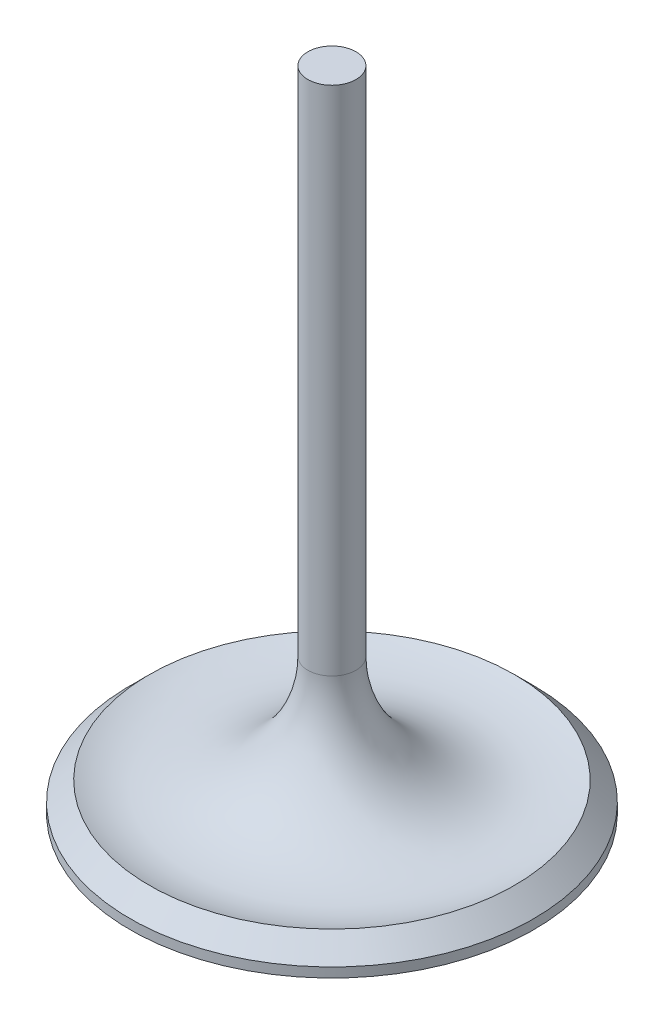
ISO-10303-21;
HEADER;
FILE_DESCRIPTION(('STEP AP214'),'2;1');
FILE_NAME('part.step','',(''),(''),'','','');
FILE_SCHEMA(('AUTOMOTIVE_DESIGN { 1 0 10303 214 1 1 1 1 }'));
ENDSEC;
DATA;
#1=APPLICATION_CONTEXT('core data for automotive mechanical design processes');
#2=APPLICATION_PROTOCOL_DEFINITION('international standard','automotive_design',2000,#1);
#3=PRODUCT_CONTEXT('',#1,'mechanical');
#4=PRODUCT('Part','Part','',(#3));
#5=PRODUCT_RELATED_PRODUCT_CATEGORY('part','',(#4));
#6=PRODUCT_DEFINITION_FORMATION('','',#4);
#7=PRODUCT_DEFINITION_CONTEXT('part definition',#1,'design');
#8=PRODUCT_DEFINITION('design','',#6,#7);
#9=PRODUCT_DEFINITION_SHAPE('','',#8);
#10=(LENGTH_UNIT() NAMED_UNIT(*) SI_UNIT(.MILLI.,.METRE.));
#11=(NAMED_UNIT(*) PLANE_ANGLE_UNIT() SI_UNIT($,.RADIAN.));
#12=(NAMED_UNIT(*) SI_UNIT($,.STERADIAN.) SOLID_ANGLE_UNIT());
#13=UNCERTAINTY_MEASURE_WITH_UNIT(LENGTH_MEASURE(1.E-05),#10,'distance_accuracy_value','');
#14=(GEOMETRIC_REPRESENTATION_CONTEXT(3) GLOBAL_UNCERTAINTY_ASSIGNED_CONTEXT((#13)) GLOBAL_UNIT_ASSIGNED_CONTEXT((#10,
#11,#12)) REPRESENTATION_CONTEXT('',''));
#15=CARTESIAN_POINT('',(0.,0.,0.));
#16=DIRECTION('',(0.,0.,1.));
#17=DIRECTION('',(1.,0.,0.));
#18=AXIS2_PLACEMENT_3D('',#15,#16,#17);
#19=CARTESIAN_POINT('',(26.67,0.,0.));
#20=DIRECTION('',(0.,-1.,0.));
#21=DIRECTION('',(0.,0.,-1.));
#22=AXIS2_PLACEMENT_3D('',#19,#20,#21);
#23=PLANE('',#22);
#24=CARTESIAN_POINT('',(0.,0.,0.));
#25=DIRECTION('',(0.,-1.,0.));
#26=DIRECTION('',(0.,0.,-1.));
#27=AXIS2_PLACEMENT_3D('',#24,#25,#26);
#28=CIRCLE('',#27,26.67);
#29=CARTESIAN_POINT('',(0.,0.,-26.67));
#30=VERTEX_POINT('',#29);
#31=EDGE_CURVE('E10',#30,#30,#28,.T.);
#32=ORIENTED_EDGE('',*,*,#31,.T.);
#33=EDGE_LOOP('',(#32));
#34=FACE_BOUND('',#33,.T.);
#35=ADVANCED_FACE('F41',(#34),#23,.T.);
#36=CARTESIAN_POINT('',(0.,0.,0.));
#37=DIRECTION('',(0.,-1.,0.));
#38=DIRECTION('',(0.,0.,-1.));
#39=AXIS2_PLACEMENT_3D('',#36,#37,#38);
#40=CYLINDRICAL_SURFACE('',#39,26.67);
#41=CARTESIAN_POINT('',(0.,1.27,0.));
#42=DIRECTION('',(0.,-1.,0.));
#43=DIRECTION('',(0.,0.,-1.));
#44=AXIS2_PLACEMENT_3D('',#41,#42,#43);
#45=CIRCLE('',#44,26.67);
#46=CARTESIAN_POINT('',(0.,1.27,-26.67));
#47=VERTEX_POINT('',#46);
#48=EDGE_CURVE('E48',#47,#47,#45,.T.);
#49=ORIENTED_EDGE('',*,*,#48,.T.);
#50=EDGE_LOOP('',(#49));
#51=FACE_BOUND('',#50,.T.);
#52=ORIENTED_EDGE('',*,*,#31,.F.);
#53=EDGE_LOOP('',(#52));
#54=FACE_BOUND('',#53,.T.);
#55=ADVANCED_FACE('F81',(#51,#54),#40,.T.);
#56=CARTESIAN_POINT('',(0.,1.27,0.));
#57=DIRECTION('',(0.,-1.,0.));
#58=DIRECTION('',(0.,0.,-1.));
#59=AXIS2_PLACEMENT_3D('',#56,#57,#58);
#60=CONICAL_SURFACE('',#59,26.67,0.785398163397457);
#61=CARTESIAN_POINT('',(0.,3.80999999999999,0.));
#62=DIRECTION('',(0.,-1.,0.));
#63=DIRECTION('',(0.,0.,-1.));
#64=AXIS2_PLACEMENT_3D('',#61,#62,#63);
#65=CIRCLE('',#64,24.13);
#66=CARTESIAN_POINT('',(0.,3.80999999999999,-24.13));
#67=VERTEX_POINT('',#66);
#68=EDGE_CURVE('E53',#67,#67,#65,.T.);
#69=ORIENTED_EDGE('',*,*,#68,.T.);
#70=EDGE_LOOP('',(#69));
#71=FACE_BOUND('',#70,.T.);
#72=ORIENTED_EDGE('',*,*,#48,.F.);
#73=EDGE_LOOP('',(#72));
#74=FACE_BOUND('',#73,.T.);
#75=ADVANCED_FACE('F85',(#71,#74),#60,.T.);
#76=CARTESIAN_POINT('',(0.,17.9546986535592,0.));
#77=DIRECTION('',(0.,-1.,0.));
#78=DIRECTION('',(0.,0.,-1.));
#79=AXIS2_PLACEMENT_3D('',#76,#77,#78);
#80=TOROIDAL_SURFACE('',#79,18.43,15.25);
#81=CARTESIAN_POINT('',(0.,17.9546986535592,0.));
#82=DIRECTION('',(0.,-1.,0.));
#83=DIRECTION('',(0.,0.,-1.));
#84=AXIS2_PLACEMENT_3D('',#81,#82,#83);
#85=CIRCLE('',#84,3.18000000000001);
#86=CARTESIAN_POINT('',(0.,17.9546986535592,-3.18000000000001));
#87=VERTEX_POINT('',#86);
#88=EDGE_CURVE('E58',#87,#87,#85,.T.);
#89=ORIENTED_EDGE('',*,*,#88,.T.);
#90=EDGE_LOOP('',(#89));
#91=FACE_BOUND('',#90,.T.);
#92=ORIENTED_EDGE('',*,*,#68,.F.);
#93=EDGE_LOOP('',(#92));
#94=FACE_BOUND('',#93,.T.);
#95=ADVANCED_FACE('F78',(#91,#94),#80,.F.);
#96=CARTESIAN_POINT('',(0.,0.,0.));
#97=DIRECTION('',(0.,-1.,0.));
#98=DIRECTION('',(0.,0.,-1.));
#99=AXIS2_PLACEMENT_3D('',#96,#97,#98);
#100=CYLINDRICAL_SURFACE('',#99,3.18000000000001);
#101=CARTESIAN_POINT('',(0.,85.55,0.));
#102=DIRECTION('',(0.,-1.,0.));
#103=DIRECTION('',(0.,0.,-1.));
#104=AXIS2_PLACEMENT_3D('',#101,#102,#103);
#105=CIRCLE('',#104,3.18);
#106=CARTESIAN_POINT('',(0.,85.55,-3.18));
#107=VERTEX_POINT('',#106);
#108=EDGE_CURVE('E64',#107,#107,#105,.T.);
#109=ORIENTED_EDGE('',*,*,#108,.T.);
#110=EDGE_LOOP('',(#109));
#111=FACE_BOUND('',#110,.T.);
#112=ORIENTED_EDGE('',*,*,#88,.F.);
#113=EDGE_LOOP('',(#112));
#114=FACE_BOUND('',#113,.T.);
#115=ADVANCED_FACE('F69',(#111,#114),#100,.T.);
#116=CARTESIAN_POINT('',(0.,85.55,0.));
#117=DIRECTION('',(0.,1.,0.));
#118=DIRECTION('',(0.,0.,1.));
#119=AXIS2_PLACEMENT_3D('',#116,#117,#118);
#120=PLANE('',#119);
#121=ORIENTED_EDGE('',*,*,#108,.F.);
#122=EDGE_LOOP('',(#121));
#123=FACE_BOUND('',#122,.T.);
#124=ADVANCED_FACE('F72',(#123),#120,.T.);
#125=CLOSED_SHELL('',(#35,#55,#75,#95,#115,#124));
#126=MANIFOLD_SOLID_BREP('B2',#125);
#127=ADVANCED_BREP_SHAPE_REPRESENTATION('',(#18,#126),#14);
#128=SHAPE_DEFINITION_REPRESENTATION(#9,#127);
ENDSEC;
END-ISO-10303-21;
